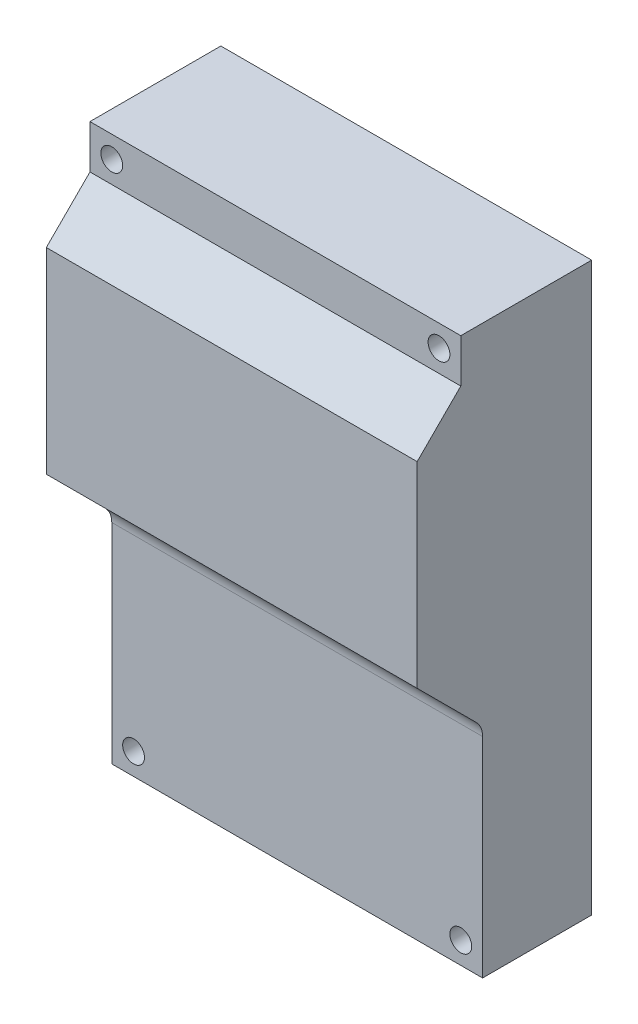
ISO-10303-21;
HEADER;
FILE_DESCRIPTION(('STEP AP214'),'2;1');
FILE_NAME('part.step','',(''),(''),'','','');
FILE_SCHEMA(('AUTOMOTIVE_DESIGN { 1 0 10303 214 1 1 1 1 }'));
ENDSEC;
DATA;
#1=APPLICATION_CONTEXT('core data for automotive mechanical design processes');
#2=APPLICATION_PROTOCOL_DEFINITION('international standard','automotive_design',2000,#1);
#3=PRODUCT_CONTEXT('',#1,'mechanical');
#4=PRODUCT('Part','Part','',(#3));
#5=PRODUCT_RELATED_PRODUCT_CATEGORY('part','',(#4));
#6=PRODUCT_DEFINITION_FORMATION('','',#4);
#7=PRODUCT_DEFINITION_CONTEXT('part definition',#1,'design');
#8=PRODUCT_DEFINITION('design','',#6,#7);
#9=PRODUCT_DEFINITION_SHAPE('','',#8);
#10=(LENGTH_UNIT() NAMED_UNIT(*) SI_UNIT(.MILLI.,.METRE.));
#11=(NAMED_UNIT(*) PLANE_ANGLE_UNIT() SI_UNIT($,.RADIAN.));
#12=(NAMED_UNIT(*) SI_UNIT($,.STERADIAN.) SOLID_ANGLE_UNIT());
#13=UNCERTAINTY_MEASURE_WITH_UNIT(LENGTH_MEASURE(1.E-05),#10,'distance_accuracy_value','');
#14=(GEOMETRIC_REPRESENTATION_CONTEXT(3) GLOBAL_UNCERTAINTY_ASSIGNED_CONTEXT((#13)) GLOBAL_UNIT_ASSIGNED_CONTEXT((#10,
#11,#12)) REPRESENTATION_CONTEXT('',''));
#15=CARTESIAN_POINT('',(0.,0.,0.));
#16=DIRECTION('',(0.,0.,1.));
#17=DIRECTION('',(1.,0.,0.));
#18=AXIS2_PLACEMENT_3D('',#15,#16,#17);
#19=CARTESIAN_POINT('',(0.,0.,40.));
#20=DIRECTION('',(0.,0.,1.));
#21=DIRECTION('',(1.,0.,0.));
#22=AXIS2_PLACEMENT_3D('',#19,#20,#21);
#23=PLANE('',#22);
#24=DIRECTION('',(1.,0.,0.));
#25=VECTOR('',#24,1.);
#26=CARTESIAN_POINT('',(-42.5,45.,40.));
#27=LINE('',#26,#25);
#28=CARTESIAN_POINT('',(-42.5,45.,40.));
#29=VERTEX_POINT('',#28);
#30=CARTESIAN_POINT('',(42.5,45.,40.));
#31=VERTEX_POINT('',#30);
#32=EDGE_CURVE('E109',#29,#31,#27,.T.);
#33=ORIENTED_EDGE('',*,*,#32,.F.);
#34=DIRECTION('',(0.,-1.,0.));
#35=VECTOR('',#34,1.);
#36=CARTESIAN_POINT('',(-42.5,65.,40.));
#37=LINE('',#36,#35);
#38=CARTESIAN_POINT('',(-42.5,0.,40.));
#39=VERTEX_POINT('',#38);
#40=EDGE_CURVE('E120',#29,#39,#37,.T.);
#41=ORIENTED_EDGE('',*,*,#40,.T.);
#42=DIRECTION('',(1.,0.,0.));
#43=VECTOR('',#42,1.);
#44=CARTESIAN_POINT('',(-42.5,0.,40.));
#45=LINE('',#44,#43);
#46=CARTESIAN_POINT('',(42.5,0.,40.));
#47=VERTEX_POINT('',#46);
#48=EDGE_CURVE('E172',#39,#47,#45,.T.);
#49=ORIENTED_EDGE('',*,*,#48,.T.);
#50=DIRECTION('',(0.,1.,0.));
#51=VECTOR('',#50,1.);
#52=CARTESIAN_POINT('',(42.5,65.,40.));
#53=LINE('',#52,#51);
#54=EDGE_CURVE('E122',#47,#31,#53,.T.);
#55=ORIENTED_EDGE('',*,*,#54,.T.);
#56=EDGE_LOOP('',(#33,#41,#49,#55));
#57=FACE_BOUND('',#56,.T.);
#58=ADVANCED_FACE('F34',(#57),#23,.T.);
#59=CARTESIAN_POINT('',(0.,0.,0.));
#60=DIRECTION('',(0.,0.,1.));
#61=DIRECTION('',(1.,0.,0.));
#62=AXIS2_PLACEMENT_3D('',#59,#60,#61);
#63=PLANE('',#62);
#64=DIRECTION('',(0.,1.,0.));
#65=VECTOR('',#64,1.);
#66=CARTESIAN_POINT('',(42.5,65.,0.));
#67=LINE('',#66,#65);
#68=CARTESIAN_POINT('',(42.5,-65.,0.));
#69=VERTEX_POINT('',#68);
#70=CARTESIAN_POINT('',(42.5,65.,0.));
#71=VERTEX_POINT('',#70);
#72=EDGE_CURVE('E137',#69,#71,#67,.T.);
#73=ORIENTED_EDGE('',*,*,#72,.F.);
#74=DIRECTION('',(1.,0.,0.));
#75=VECTOR('',#74,1.);
#76=CARTESIAN_POINT('',(-42.5,-65.,0.));
#77=LINE('',#76,#75);
#78=CARTESIAN_POINT('',(-42.5,-65.,0.));
#79=VERTEX_POINT('',#78);
#80=EDGE_CURVE('E133',#79,#69,#77,.T.);
#81=ORIENTED_EDGE('',*,*,#80,.F.);
#82=DIRECTION('',(0.,-1.,0.));
#83=VECTOR('',#82,1.);
#84=CARTESIAN_POINT('',(-42.5,65.,0.));
#85=LINE('',#84,#83);
#86=CARTESIAN_POINT('',(-42.5,65.,0.));
#87=VERTEX_POINT('',#86);
#88=EDGE_CURVE('E144',#87,#79,#85,.T.);
#89=ORIENTED_EDGE('',*,*,#88,.F.);
#90=DIRECTION('',(-1.,0.,0.));
#91=VECTOR('',#90,1.);
#92=CARTESIAN_POINT('',(-42.5,65.,0.));
#93=LINE('',#92,#91);
#94=EDGE_CURVE('E140',#71,#87,#93,.T.);
#95=ORIENTED_EDGE('',*,*,#94,.F.);
#96=EDGE_LOOP('',(#73,#81,#89,#95));
#97=FACE_BOUND('',#96,.T.);
#98=CARTESIAN_POINT('',(-37.5,60.,0.));
#99=DIRECTION('',(0.,0.,1.));
#100=DIRECTION('',(1.,0.,0.));
#101=AXIS2_PLACEMENT_3D('',#98,#99,#100);
#102=CIRCLE('',#101,2.5);
#103=CARTESIAN_POINT('',(-35.,60.,0.));
#104=VERTEX_POINT('',#103);
#105=EDGE_CURVE('E141',#104,#104,#102,.T.);
#106=ORIENTED_EDGE('',*,*,#105,.T.);
#107=EDGE_LOOP('',(#106));
#108=FACE_BOUND('',#107,.T.);
#109=CARTESIAN_POINT('',(37.5,60.,0.));
#110=DIRECTION('',(0.,0.,1.));
#111=DIRECTION('',(1.,0.,0.));
#112=AXIS2_PLACEMENT_3D('',#109,#110,#111);
#113=CIRCLE('',#112,2.5);
#114=CARTESIAN_POINT('',(40.,60.,0.));
#115=VERTEX_POINT('',#114);
#116=EDGE_CURVE('E197',#115,#115,#113,.T.);
#117=ORIENTED_EDGE('',*,*,#116,.T.);
#118=EDGE_LOOP('',(#117));
#119=FACE_BOUND('',#118,.T.);
#120=CARTESIAN_POINT('',(37.5000000000013,-60.,0.));
#121=DIRECTION('',(0.,0.,1.));
#122=DIRECTION('',(1.,0.,0.));
#123=AXIS2_PLACEMENT_3D('',#120,#121,#122);
#124=CIRCLE('',#123,2.5);
#125=CARTESIAN_POINT('',(40.0000000000013,-60.,0.));
#126=VERTEX_POINT('',#125);
#127=EDGE_CURVE('E194',#126,#126,#124,.T.);
#128=ORIENTED_EDGE('',*,*,#127,.T.);
#129=EDGE_LOOP('',(#128));
#130=FACE_BOUND('',#129,.T.);
#131=CARTESIAN_POINT('',(-37.4999999999987,-60.,0.));
#132=DIRECTION('',(0.,0.,1.));
#133=DIRECTION('',(1.,0.,0.));
#134=AXIS2_PLACEMENT_3D('',#131,#132,#133);
#135=CIRCLE('',#134,2.5);
#136=CARTESIAN_POINT('',(-34.9999999999987,-60.,0.));
#137=VERTEX_POINT('',#136);
#138=EDGE_CURVE('E191',#137,#137,#135,.T.);
#139=ORIENTED_EDGE('',*,*,#138,.T.);
#140=EDGE_LOOP('',(#139));
#141=FACE_BOUND('',#140,.T.);
#142=ADVANCED_FACE('F202',(#97,#108,#119,#130,#141),#63,.F.);
#143=CARTESIAN_POINT('',(42.5,65.,40.));
#144=DIRECTION('',(-1.,0.,0.));
#145=DIRECTION('',(0.,-1.,0.));
#146=AXIS2_PLACEMENT_3D('',#143,#144,#145);
#147=PLANE('',#146);
#148=DIRECTION('',(0.,0.,-1.));
#149=VECTOR('',#148,1.);
#150=CARTESIAN_POINT('',(42.5,65.,40.));
#151=LINE('',#150,#149);
#152=CARTESIAN_POINT('',(42.5,65.,30.));
#153=VERTEX_POINT('',#152);
#154=EDGE_CURVE('E11',#153,#71,#151,.T.);
#155=ORIENTED_EDGE('',*,*,#154,.F.);
#156=DIRECTION('',(0.,1.,0.));
#157=VECTOR('',#156,1.);
#158=CARTESIAN_POINT('',(42.5,65.,30.));
#159=LINE('',#158,#157);
#160=CARTESIAN_POINT('',(42.5,55.,30.));
#161=VERTEX_POINT('',#160);
#162=EDGE_CURVE('E114',#161,#153,#159,.T.);
#163=ORIENTED_EDGE('',*,*,#162,.F.);
#164=DIRECTION('',(0.,0.707106781186546,-0.707106781186548));
#165=VECTOR('',#164,1.);
#166=CARTESIAN_POINT('',(42.5,55.,30.));
#167=LINE('',#166,#165);
#168=EDGE_CURVE('E182',#31,#161,#167,.T.);
#169=ORIENTED_EDGE('',*,*,#168,.F.);
#170=ORIENTED_EDGE('',*,*,#54,.F.);
#171=DIRECTION('',(0.,0.707106781186546,0.707106781186549));
#172=VECTOR('',#171,1.);
#173=CARTESIAN_POINT('',(42.5,-13.5355339059327,26.4644660940673));
#174=LINE('',#173,#172);
#175=CARTESIAN_POINT('',(42.5,-13.5355339059327,26.4644660940673));
#176=VERTEX_POINT('',#175);
#177=EDGE_CURVE('E173',#176,#47,#174,.T.);
#178=ORIENTED_EDGE('',*,*,#177,.F.);
#179=CARTESIAN_POINT('',(42.5,-17.0710678118654,30.));
#180=DIRECTION('',(1.,0.,0.));
#181=DIRECTION('',(0.,1.,0.));
#182=AXIS2_PLACEMENT_3D('',#179,#180,#181);
#183=CIRCLE('',#182,5.);
#184=CARTESIAN_POINT('',(42.5,-17.0710678118654,25.));
#185=VERTEX_POINT('',#184);
#186=EDGE_CURVE('E168',#185,#176,#183,.T.);
#187=ORIENTED_EDGE('',*,*,#186,.F.);
#188=DIRECTION('',(0.,1.,0.));
#189=VECTOR('',#188,1.);
#190=CARTESIAN_POINT('',(42.5,-65.,25.));
#191=LINE('',#190,#189);
#192=CARTESIAN_POINT('',(42.5,-65.,25.));
#193=VERTEX_POINT('',#192);
#194=EDGE_CURVE('E175',#193,#185,#191,.T.);
#195=ORIENTED_EDGE('',*,*,#194,.F.);
#196=DIRECTION('',(0.,0.,-1.));
#197=VECTOR('',#196,1.);
#198=CARTESIAN_POINT('',(42.5,-65.,40.));
#199=LINE('',#198,#197);
#200=EDGE_CURVE('E129',#193,#69,#199,.T.);
#201=ORIENTED_EDGE('',*,*,#200,.T.);
#202=ORIENTED_EDGE('',*,*,#72,.T.);
#203=EDGE_LOOP('',(#155,#163,#169,#170,#178,#187,#195,#201,#202));
#204=FACE_BOUND('',#203,.T.);
#205=ADVANCED_FACE('F36',(#204),#147,.F.);
#206=CARTESIAN_POINT('',(-42.5,65.,40.));
#207=DIRECTION('',(0.,-1.,0.));
#208=DIRECTION('',(0.,0.,-1.));
#209=AXIS2_PLACEMENT_3D('',#206,#207,#208);
#210=PLANE('',#209);
#211=DIRECTION('',(0.,0.,-1.));
#212=VECTOR('',#211,1.);
#213=CARTESIAN_POINT('',(-42.5,65.,40.));
#214=LINE('',#213,#212);
#215=CARTESIAN_POINT('',(-42.5,65.,30.));
#216=VERTEX_POINT('',#215);
#217=EDGE_CURVE('E43',#216,#87,#214,.T.);
#218=ORIENTED_EDGE('',*,*,#217,.F.);
#219=DIRECTION('',(1.,0.,0.));
#220=VECTOR('',#219,1.);
#221=CARTESIAN_POINT('',(-42.5,65.,30.));
#222=LINE('',#221,#220);
#223=EDGE_CURVE('E153',#216,#153,#222,.T.);
#224=ORIENTED_EDGE('',*,*,#223,.T.);
#225=ORIENTED_EDGE('',*,*,#154,.T.);
#226=ORIENTED_EDGE('',*,*,#94,.T.);
#227=EDGE_LOOP('',(#218,#224,#225,#226));
#228=FACE_BOUND('',#227,.T.);
#229=ADVANCED_FACE('F230',(#228),#210,.F.);
#230=CARTESIAN_POINT('',(-42.5,65.,40.));
#231=DIRECTION('',(1.,0.,0.));
#232=DIRECTION('',(0.,1.,0.));
#233=AXIS2_PLACEMENT_3D('',#230,#231,#232);
#234=PLANE('',#233);
#235=DIRECTION('',(0.,0.707106781186546,-0.707106781186548));
#236=VECTOR('',#235,1.);
#237=CARTESIAN_POINT('',(-42.5,55.,30.));
#238=LINE('',#237,#236);
#239=CARTESIAN_POINT('',(-42.5,54.9999999999999,30.));
#240=VERTEX_POINT('',#239);
#241=EDGE_CURVE('E105',#29,#240,#238,.T.);
#242=ORIENTED_EDGE('',*,*,#241,.T.);
#243=DIRECTION('',(0.,1.,0.));
#244=VECTOR('',#243,1.);
#245=CARTESIAN_POINT('',(-42.5,65.,30.));
#246=LINE('',#245,#244);
#247=EDGE_CURVE('E51',#240,#216,#246,.T.);
#248=ORIENTED_EDGE('',*,*,#247,.T.);
#249=ORIENTED_EDGE('',*,*,#217,.T.);
#250=ORIENTED_EDGE('',*,*,#88,.T.);
#251=DIRECTION('',(0.,0.,-1.));
#252=VECTOR('',#251,1.);
#253=CARTESIAN_POINT('',(-42.5,-65.,40.));
#254=LINE('',#253,#252);
#255=CARTESIAN_POINT('',(-42.5,-65.,25.));
#256=VERTEX_POINT('',#255);
#257=EDGE_CURVE('E131',#256,#79,#254,.T.);
#258=ORIENTED_EDGE('',*,*,#257,.F.);
#259=DIRECTION('',(0.,1.,0.));
#260=VECTOR('',#259,1.);
#261=CARTESIAN_POINT('',(-42.5,-65.,25.));
#262=LINE('',#261,#260);
#263=CARTESIAN_POINT('',(-42.5,-17.0710678118654,25.));
#264=VERTEX_POINT('',#263);
#265=EDGE_CURVE('E59',#256,#264,#262,.T.);
#266=ORIENTED_EDGE('',*,*,#265,.T.);
#267=CARTESIAN_POINT('',(-42.5,-17.0710678118654,30.));
#268=DIRECTION('',(1.,0.,0.));
#269=DIRECTION('',(0.,1.,0.));
#270=AXIS2_PLACEMENT_3D('',#267,#268,#269);
#271=CIRCLE('',#270,5.);
#272=CARTESIAN_POINT('',(-42.5,-13.5355339059327,26.4644660940673));
#273=VERTEX_POINT('',#272);
#274=EDGE_CURVE('E170',#264,#273,#271,.T.);
#275=ORIENTED_EDGE('',*,*,#274,.T.);
#276=DIRECTION('',(0.,0.707106781186546,0.707106781186549));
#277=VECTOR('',#276,1.);
#278=CARTESIAN_POINT('',(-42.5,-13.5355339059327,26.4644660940673));
#279=LINE('',#278,#277);
#280=EDGE_CURVE('E128',#273,#39,#279,.T.);
#281=ORIENTED_EDGE('',*,*,#280,.T.);
#282=ORIENTED_EDGE('',*,*,#40,.F.);
#283=EDGE_LOOP('',(#242,#248,#249,#250,#258,#266,#275,#281,#282));
#284=FACE_BOUND('',#283,.T.);
#285=ADVANCED_FACE('F125',(#284),#234,.F.);
#286=CARTESIAN_POINT('',(-42.5,-65.,40.));
#287=DIRECTION('',(0.,1.,0.));
#288=DIRECTION('',(0.,0.,1.));
#289=AXIS2_PLACEMENT_3D('',#286,#287,#288);
#290=PLANE('',#289);
#291=ORIENTED_EDGE('',*,*,#200,.F.);
#292=DIRECTION('',(1.,0.,0.));
#293=VECTOR('',#292,1.);
#294=CARTESIAN_POINT('',(-42.5,-65.,25.));
#295=LINE('',#294,#293);
#296=EDGE_CURVE('E185',#256,#193,#295,.T.);
#297=ORIENTED_EDGE('',*,*,#296,.F.);
#298=ORIENTED_EDGE('',*,*,#257,.T.);
#299=ORIENTED_EDGE('',*,*,#80,.T.);
#300=EDGE_LOOP('',(#291,#297,#298,#299));
#301=FACE_BOUND('',#300,.T.);
#302=ADVANCED_FACE('F208',(#301),#290,.F.);
#303=CARTESIAN_POINT('',(-37.5,60.,40.));
#304=DIRECTION('',(0.,0.,-1.));
#305=DIRECTION('',(-1.,0.,0.));
#306=AXIS2_PLACEMENT_3D('',#303,#304,#305);
#307=CYLINDRICAL_SURFACE('',#306,2.5);
#308=CARTESIAN_POINT('',(-37.5,60.,30.));
#309=DIRECTION('',(0.,0.,-1.));
#310=DIRECTION('',(-1.,0.,0.));
#311=AXIS2_PLACEMENT_3D('',#308,#309,#310);
#312=CIRCLE('',#311,2.5);
#313=CARTESIAN_POINT('',(-40.,60.,30.));
#314=VERTEX_POINT('',#313);
#315=EDGE_CURVE('E188',#314,#314,#312,.T.);
#316=ORIENTED_EDGE('',*,*,#315,.F.);
#317=EDGE_LOOP('',(#316));
#318=FACE_BOUND('',#317,.T.);
#319=ORIENTED_EDGE('',*,*,#105,.F.);
#320=EDGE_LOOP('',(#319));
#321=FACE_BOUND('',#320,.T.);
#322=ADVANCED_FACE('F205',(#318,#321),#307,.F.);
#323=CARTESIAN_POINT('',(37.5,60.,40.));
#324=DIRECTION('',(0.,0.,-1.));
#325=DIRECTION('',(-1.,0.,0.));
#326=AXIS2_PLACEMENT_3D('',#323,#324,#325);
#327=CYLINDRICAL_SURFACE('',#326,2.5);
#328=CARTESIAN_POINT('',(37.5,60.,30.));
#329=DIRECTION('',(0.,0.,-1.));
#330=DIRECTION('',(-1.,0.,0.));
#331=AXIS2_PLACEMENT_3D('',#328,#329,#330);
#332=CIRCLE('',#331,2.5);
#333=CARTESIAN_POINT('',(35.,60.,30.));
#334=VERTEX_POINT('',#333);
#335=EDGE_CURVE('E38',#334,#334,#332,.T.);
#336=ORIENTED_EDGE('',*,*,#335,.F.);
#337=EDGE_LOOP('',(#336));
#338=FACE_BOUND('',#337,.T.);
#339=ORIENTED_EDGE('',*,*,#116,.F.);
#340=EDGE_LOOP('',(#339));
#341=FACE_BOUND('',#340,.T.);
#342=ADVANCED_FACE('F207',(#338,#341),#327,.F.);
#343=CARTESIAN_POINT('',(37.5000000000013,-60.,40.));
#344=DIRECTION('',(0.,0.,-1.));
#345=DIRECTION('',(-1.,0.,0.));
#346=AXIS2_PLACEMENT_3D('',#343,#344,#345);
#347=CYLINDRICAL_SURFACE('',#346,2.5);
#348=CARTESIAN_POINT('',(37.5000000000013,-60.,25.));
#349=DIRECTION('',(0.,0.,-1.));
#350=DIRECTION('',(-1.,0.,0.));
#351=AXIS2_PLACEMENT_3D('',#348,#349,#350);
#352=CIRCLE('',#351,2.5);
#353=CARTESIAN_POINT('',(35.0000000000012,-60.,25.));
#354=VERTEX_POINT('',#353);
#355=EDGE_CURVE('E152',#354,#354,#352,.T.);
#356=ORIENTED_EDGE('',*,*,#355,.F.);
#357=EDGE_LOOP('',(#356));
#358=FACE_BOUND('',#357,.T.);
#359=ORIENTED_EDGE('',*,*,#127,.F.);
#360=EDGE_LOOP('',(#359));
#361=FACE_BOUND('',#360,.T.);
#362=ADVANCED_FACE('F215',(#358,#361),#347,.F.);
#363=CARTESIAN_POINT('',(-37.4999999999987,-60.,40.));
#364=DIRECTION('',(0.,0.,-1.));
#365=DIRECTION('',(-1.,0.,0.));
#366=AXIS2_PLACEMENT_3D('',#363,#364,#365);
#367=CYLINDRICAL_SURFACE('',#366,2.5);
#368=CARTESIAN_POINT('',(-37.4999999999987,-60.,25.));
#369=DIRECTION('',(0.,0.,-1.));
#370=DIRECTION('',(-1.,0.,0.));
#371=AXIS2_PLACEMENT_3D('',#368,#369,#370);
#372=CIRCLE('',#371,2.5);
#373=CARTESIAN_POINT('',(-39.9999999999987,-60.,25.));
#374=VERTEX_POINT('',#373);
#375=EDGE_CURVE('E150',#374,#374,#372,.T.);
#376=ORIENTED_EDGE('',*,*,#375,.F.);
#377=EDGE_LOOP('',(#376));
#378=FACE_BOUND('',#377,.T.);
#379=ORIENTED_EDGE('',*,*,#138,.F.);
#380=EDGE_LOOP('',(#379));
#381=FACE_BOUND('',#380,.T.);
#382=ADVANCED_FACE('F268',(#378,#381),#367,.F.);
#383=CARTESIAN_POINT('',(-42.5,-13.5355339059327,26.4644660940673));
#384=DIRECTION('',(0.,0.707106781186549,-0.707106781186546));
#385=DIRECTION('',(0.,0.707106781186546,0.707106781186549));
#386=AXIS2_PLACEMENT_3D('',#383,#384,#385);
#387=PLANE('',#386);
#388=ORIENTED_EDGE('',*,*,#177,.T.);
#389=ORIENTED_EDGE('',*,*,#48,.F.);
#390=ORIENTED_EDGE('',*,*,#280,.F.);
#391=DIRECTION('',(1.,0.,0.));
#392=VECTOR('',#391,1.);
#393=CARTESIAN_POINT('',(-42.5,-13.5355339059327,26.4644660940673));
#394=LINE('',#393,#392);
#395=EDGE_CURVE('E180',#273,#176,#394,.T.);
#396=ORIENTED_EDGE('',*,*,#395,.T.);
#397=EDGE_LOOP('',(#388,#389,#390,#396));
#398=FACE_BOUND('',#397,.T.);
#399=ADVANCED_FACE('F251',(#398),#387,.F.);
#400=CARTESIAN_POINT('',(-42.5,-17.0710678118654,30.));
#401=DIRECTION('',(1.,0.,0.));
#402=DIRECTION('',(0.,1.,0.));
#403=AXIS2_PLACEMENT_3D('',#400,#401,#402);
#404=CYLINDRICAL_SURFACE('',#403,5.);
#405=ORIENTED_EDGE('',*,*,#186,.T.);
#406=ORIENTED_EDGE('',*,*,#395,.F.);
#407=ORIENTED_EDGE('',*,*,#274,.F.);
#408=DIRECTION('',(1.,0.,0.));
#409=VECTOR('',#408,1.);
#410=CARTESIAN_POINT('',(-42.5,-17.0710678118654,25.));
#411=LINE('',#410,#409);
#412=EDGE_CURVE('E183',#264,#185,#411,.T.);
#413=ORIENTED_EDGE('',*,*,#412,.T.);
#414=EDGE_LOOP('',(#405,#406,#407,#413));
#415=FACE_BOUND('',#414,.T.);
#416=ADVANCED_FACE('F247',(#415),#404,.F.);
#417=CARTESIAN_POINT('',(-42.5,-65.,25.));
#418=DIRECTION('',(0.,0.,-1.));
#419=DIRECTION('',(-1.,0.,0.));
#420=AXIS2_PLACEMENT_3D('',#417,#418,#419);
#421=PLANE('',#420);
#422=ORIENTED_EDGE('',*,*,#355,.T.);
#423=EDGE_LOOP('',(#422));
#424=FACE_BOUND('',#423,.T.);
#425=ORIENTED_EDGE('',*,*,#375,.T.);
#426=EDGE_LOOP('',(#425));
#427=FACE_BOUND('',#426,.T.);
#428=ORIENTED_EDGE('',*,*,#194,.T.);
#429=ORIENTED_EDGE('',*,*,#412,.F.);
#430=ORIENTED_EDGE('',*,*,#265,.F.);
#431=ORIENTED_EDGE('',*,*,#296,.T.);
#432=EDGE_LOOP('',(#428,#429,#430,#431));
#433=FACE_BOUND('',#432,.T.);
#434=ADVANCED_FACE('F253',(#424,#427,#433),#421,.F.);
#435=CARTESIAN_POINT('',(-42.5,65.,30.));
#436=DIRECTION('',(0.,0.,-1.));
#437=DIRECTION('',(-1.,0.,0.));
#438=AXIS2_PLACEMENT_3D('',#435,#436,#437);
#439=PLANE('',#438);
#440=ORIENTED_EDGE('',*,*,#315,.T.);
#441=EDGE_LOOP('',(#440));
#442=FACE_BOUND('',#441,.T.);
#443=ORIENTED_EDGE('',*,*,#335,.T.);
#444=EDGE_LOOP('',(#443));
#445=FACE_BOUND('',#444,.T.);
#446=ORIENTED_EDGE('',*,*,#162,.T.);
#447=ORIENTED_EDGE('',*,*,#223,.F.);
#448=ORIENTED_EDGE('',*,*,#247,.F.);
#449=DIRECTION('',(1.,0.,0.));
#450=VECTOR('',#449,1.);
#451=CARTESIAN_POINT('',(-42.5,55.,30.));
#452=LINE('',#451,#450);
#453=EDGE_CURVE('E111',#240,#161,#452,.T.);
#454=ORIENTED_EDGE('',*,*,#453,.T.);
#455=EDGE_LOOP('',(#446,#447,#448,#454));
#456=FACE_BOUND('',#455,.T.);
#457=ADVANCED_FACE('F242',(#442,#445,#456),#439,.F.);
#458=CARTESIAN_POINT('',(-42.5,55.,30.));
#459=DIRECTION('',(0.,-0.707106781186548,-0.707106781186547));
#460=DIRECTION('',(0.,0.707106781186547,-0.707106781186548));
#461=AXIS2_PLACEMENT_3D('',#458,#459,#460);
#462=PLANE('',#461);
#463=ORIENTED_EDGE('',*,*,#168,.T.);
#464=ORIENTED_EDGE('',*,*,#453,.F.);
#465=ORIENTED_EDGE('',*,*,#241,.F.);
#466=ORIENTED_EDGE('',*,*,#32,.T.);
#467=EDGE_LOOP('',(#463,#464,#465,#466));
#468=FACE_BOUND('',#467,.T.);
#469=ADVANCED_FACE('F108',(#468),#462,.F.);
#470=CLOSED_SHELL('',(#58,#142,#205,#229,#285,#302,#322,#342,#362,#382,#399,#416,#434,#457,#469));
#471=MANIFOLD_SOLID_BREP('B2',#470);
#472=ADVANCED_BREP_SHAPE_REPRESENTATION('',(#18,#471),#14);
#473=SHAPE_DEFINITION_REPRESENTATION(#9,#472);
ENDSEC;
END-ISO-10303-21;
